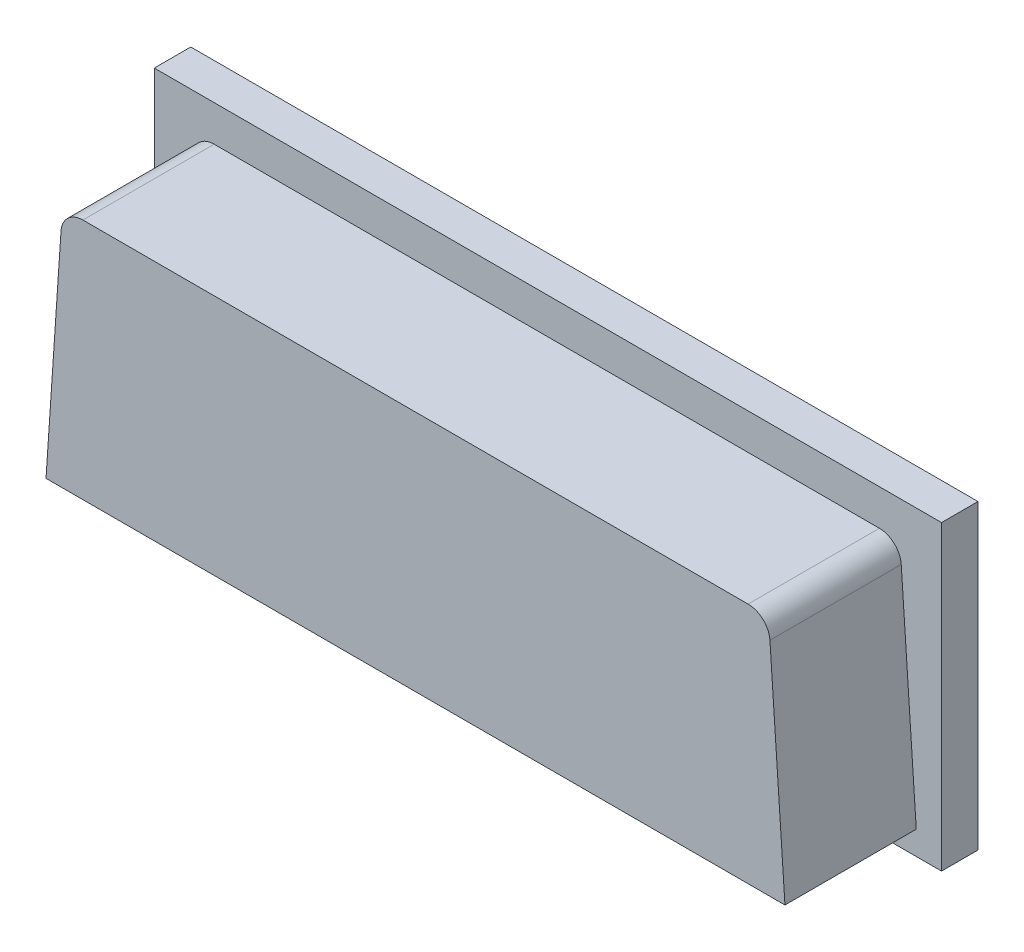
ISO-10303-21;
HEADER;
FILE_DESCRIPTION(('STEP AP214'),'2;1');
FILE_NAME('part.step','',(''),(''),'','','');
FILE_SCHEMA(('AUTOMOTIVE_DESIGN { 1 0 10303 214 1 1 1 1 }'));
ENDSEC;
DATA;
#1=APPLICATION_CONTEXT('core data for automotive mechanical design processes');
#2=APPLICATION_PROTOCOL_DEFINITION('international standard','automotive_design',2000,#1);
#3=PRODUCT_CONTEXT('',#1,'mechanical');
#4=PRODUCT('Part','Part','',(#3));
#5=PRODUCT_RELATED_PRODUCT_CATEGORY('part','',(#4));
#6=PRODUCT_DEFINITION_FORMATION('','',#4);
#7=PRODUCT_DEFINITION_CONTEXT('part definition',#1,'design');
#8=PRODUCT_DEFINITION('design','',#6,#7);
#9=PRODUCT_DEFINITION_SHAPE('','',#8);
#10=(LENGTH_UNIT() NAMED_UNIT(*) SI_UNIT(.MILLI.,.METRE.));
#11=(NAMED_UNIT(*) PLANE_ANGLE_UNIT() SI_UNIT($,.RADIAN.));
#12=(NAMED_UNIT(*) SI_UNIT($,.STERADIAN.) SOLID_ANGLE_UNIT());
#13=UNCERTAINTY_MEASURE_WITH_UNIT(LENGTH_MEASURE(1.E-05),#10,'distance_accuracy_value','');
#14=(GEOMETRIC_REPRESENTATION_CONTEXT(3) GLOBAL_UNCERTAINTY_ASSIGNED_CONTEXT((#13)) GLOBAL_UNIT_ASSIGNED_CONTEXT((#10,
#11,#12)) REPRESENTATION_CONTEXT('',''));
#15=CARTESIAN_POINT('',(0.,0.,0.));
#16=DIRECTION('',(0.,0.,1.));
#17=DIRECTION('',(1.,0.,0.));
#18=AXIS2_PLACEMENT_3D('',#15,#16,#17);
#19=CARTESIAN_POINT('',(0.,0.,18.));
#20=DIRECTION('',(0.997711420500141,-0.0676159848230516,0.));
#21=DIRECTION('',(0.0676159848230516,0.997711420500141,0.));
#22=AXIS2_PLACEMENT_3D('',#19,#20,#21);
#23=PLANE('',#22);
#24=DIRECTION('',(-0.0676159848230516,-0.997711420500141,0.));
#25=VECTOR('',#24,1.);
#26=CARTESIAN_POINT('',(0.,0.,18.));
#27=LINE('',#26,#25);
#28=CARTESIAN_POINT('',(2.06043397281794,30.4028479544692,18.));
#29=VERTEX_POINT('',#28);
#30=CARTESIAN_POINT('',(0.,0.,18.));
#31=VERTEX_POINT('',#30);
#32=EDGE_CURVE('E147',#29,#31,#27,.T.);
#33=ORIENTED_EDGE('',*,*,#32,.F.);
#34=DIRECTION('',(0.,0.,-1.));
#35=VECTOR('',#34,1.);
#36=CARTESIAN_POINT('',(2.06043397281794,30.4028479544692,18.));
#37=LINE('',#36,#35);
#38=CARTESIAN_POINT('',(2.06043397281794,30.4028479544692,0.));
#39=VERTEX_POINT('',#38);
#40=EDGE_CURVE('E167',#29,#39,#37,.T.);
#41=ORIENTED_EDGE('',*,*,#40,.T.);
#42=DIRECTION('',(-0.0676159848230516,-0.997711420500141,0.));
#43=VECTOR('',#42,1.);
#44=CARTESIAN_POINT('',(0.,0.,0.));
#45=LINE('',#44,#43);
#46=CARTESIAN_POINT('',(0.,0.,0.));
#47=VERTEX_POINT('',#46);
#48=EDGE_CURVE('E138',#39,#47,#45,.T.);
#49=ORIENTED_EDGE('',*,*,#48,.T.);
#50=DIRECTION('',(0.,0.,-1.));
#51=VECTOR('',#50,1.);
#52=CARTESIAN_POINT('',(0.,0.,18.));
#53=LINE('',#52,#51);
#54=EDGE_CURVE('E164',#31,#47,#53,.T.);
#55=ORIENTED_EDGE('',*,*,#54,.F.);
#56=EDGE_LOOP('',(#33,#41,#49,#55));
#57=FACE_BOUND('',#56,.T.);
#58=ADVANCED_FACE('F34',(#57),#23,.F.);
#59=CARTESIAN_POINT('',(0.,0.,18.));
#60=DIRECTION('',(0.,1.,0.));
#61=DIRECTION('',(0.,0.,1.));
#62=AXIS2_PLACEMENT_3D('',#59,#60,#61);
#63=PLANE('',#62);
#64=DIRECTION('',(1.,0.,0.));
#65=VECTOR('',#64,1.);
#66=CARTESIAN_POINT('',(0.,0.,0.));
#67=LINE('',#66,#65);
#68=CARTESIAN_POINT('',(101.3,0.,0.));
#69=VERTEX_POINT('',#68);
#70=EDGE_CURVE('E141',#47,#69,#67,.T.);
#71=ORIENTED_EDGE('',*,*,#70,.T.);
#72=DIRECTION('',(0.,0.,-1.));
#73=VECTOR('',#72,1.);
#74=CARTESIAN_POINT('',(101.3,0.,18.));
#75=LINE('',#74,#73);
#76=CARTESIAN_POINT('',(101.3,0.,18.));
#77=VERTEX_POINT('',#76);
#78=EDGE_CURVE('E155',#77,#69,#75,.T.);
#79=ORIENTED_EDGE('',*,*,#78,.F.);
#80=DIRECTION('',(1.,0.,0.));
#81=VECTOR('',#80,1.);
#82=CARTESIAN_POINT('',(0.,0.,18.));
#83=LINE('',#82,#81);
#84=EDGE_CURVE('E149',#31,#77,#83,.T.);
#85=ORIENTED_EDGE('',*,*,#84,.F.);
#86=ORIENTED_EDGE('',*,*,#54,.T.);
#87=EDGE_LOOP('',(#71,#79,#85,#86));
#88=FACE_BOUND('',#87,.T.);
#89=ADVANCED_FACE('F201',(#88),#63,.F.);
#90=CARTESIAN_POINT('',(101.3,0.,18.));
#91=DIRECTION('',(-0.997711420500141,-0.0676159848230517,0.));
#92=DIRECTION('',(0.0676159848230517,-0.997711420500141,0.));
#93=AXIS2_PLACEMENT_3D('',#90,#91,#92);
#94=PLANE('',#93);
#95=DIRECTION('',(-0.0676159848230517,0.997711420500141,0.));
#96=VECTOR('',#95,1.);
#97=CARTESIAN_POINT('',(101.3,0.,0.));
#98=LINE('',#97,#96);
#99=CARTESIAN_POINT('',(99.2395660271821,30.4028479544692,0.));
#100=VERTEX_POINT('',#99);
#101=EDGE_CURVE('E159',#69,#100,#98,.T.);
#102=ORIENTED_EDGE('',*,*,#101,.T.);
#103=DIRECTION('',(0.,0.,-1.));
#104=VECTOR('',#103,1.);
#105=CARTESIAN_POINT('',(99.2395660271821,30.4028479544692,18.));
#106=LINE('',#105,#104);
#107=CARTESIAN_POINT('',(99.2395660271821,30.4028479544692,18.));
#108=VERTEX_POINT('',#107);
#109=EDGE_CURVE('E11',#100,#108,#106,.F.);
#110=ORIENTED_EDGE('',*,*,#109,.T.);
#111=DIRECTION('',(-0.0676159848230517,0.997711420500141,0.));
#112=VECTOR('',#111,1.);
#113=CARTESIAN_POINT('',(101.3,0.,18.));
#114=LINE('',#113,#112);
#115=EDGE_CURVE('E152',#77,#108,#114,.T.);
#116=ORIENTED_EDGE('',*,*,#115,.F.);
#117=ORIENTED_EDGE('',*,*,#78,.T.);
#118=EDGE_LOOP('',(#102,#110,#116,#117));
#119=FACE_BOUND('',#118,.T.);
#120=ADVANCED_FACE('F198',(#119),#94,.F.);
#121=CARTESIAN_POINT('',(2.25,33.2,18.));
#122=DIRECTION('',(0.,-1.,0.));
#123=DIRECTION('',(1.,0.,0.));
#124=AXIS2_PLACEMENT_3D('',#121,#122,#123);
#125=PLANE('',#124);
#126=DIRECTION('',(-1.,0.,0.));
#127=VECTOR('',#126,1.);
#128=CARTESIAN_POINT('',(2.25,33.2,0.));
#129=LINE('',#128,#127);
#130=CARTESIAN_POINT('',(96.2464317656816,33.2,0.));
#131=VERTEX_POINT('',#130);
#132=CARTESIAN_POINT('',(5.05356823431836,33.2,0.));
#133=VERTEX_POINT('',#132);
#134=EDGE_CURVE('E150',#131,#133,#129,.T.);
#135=ORIENTED_EDGE('',*,*,#134,.T.);
#136=DIRECTION('',(0.,0.,-1.));
#137=VECTOR('',#136,1.);
#138=CARTESIAN_POINT('',(5.05356823431836,33.2,18.));
#139=LINE('',#138,#137);
#140=CARTESIAN_POINT('',(5.05356823431836,33.2,18.));
#141=VERTEX_POINT('',#140);
#142=EDGE_CURVE('E55',#133,#141,#139,.F.);
#143=ORIENTED_EDGE('',*,*,#142,.T.);
#144=DIRECTION('',(-1.,0.,0.));
#145=VECTOR('',#144,1.);
#146=CARTESIAN_POINT('',(2.25,33.2,18.));
#147=LINE('',#146,#145);
#148=CARTESIAN_POINT('',(96.2464317656816,33.2,18.));
#149=VERTEX_POINT('',#148);
#150=EDGE_CURVE('E154',#149,#141,#147,.T.);
#151=ORIENTED_EDGE('',*,*,#150,.F.);
#152=DIRECTION('',(0.,0.,-1.));
#153=VECTOR('',#152,1.);
#154=CARTESIAN_POINT('',(96.2464317656816,33.2,18.));
#155=LINE('',#154,#153);
#156=EDGE_CURVE('E174',#149,#131,#155,.T.);
#157=ORIENTED_EDGE('',*,*,#156,.T.);
#158=EDGE_LOOP('',(#135,#143,#151,#157));
#159=FACE_BOUND('',#158,.T.);
#160=ADVANCED_FACE('F194',(#159),#125,.F.);
#161=CARTESIAN_POINT('',(0.,0.,18.));
#162=DIRECTION('',(0.,0.,-1.));
#163=DIRECTION('',(-1.,0.,0.));
#164=AXIS2_PLACEMENT_3D('',#161,#162,#163);
#165=PLANE('',#164);
#166=ORIENTED_EDGE('',*,*,#150,.T.);
#167=CARTESIAN_POINT('',(5.05356823431836,30.2,18.));
#168=DIRECTION('',(0.,0.,-1.));
#169=DIRECTION('',(-1.,0.,0.));
#170=AXIS2_PLACEMENT_3D('',#167,#168,#169);
#171=CIRCLE('',#170,3.);
#172=EDGE_CURVE('E42',#141,#29,#171,.F.);
#173=ORIENTED_EDGE('',*,*,#172,.T.);
#174=ORIENTED_EDGE('',*,*,#32,.T.);
#175=ORIENTED_EDGE('',*,*,#84,.T.);
#176=ORIENTED_EDGE('',*,*,#115,.T.);
#177=CARTESIAN_POINT('',(96.2464317656816,30.2,18.));
#178=DIRECTION('',(0.,0.,-1.));
#179=DIRECTION('',(-1.,0.,0.));
#180=AXIS2_PLACEMENT_3D('',#177,#178,#179);
#181=CIRCLE('',#180,3.);
#182=EDGE_CURVE('E178',#108,#149,#181,.F.);
#183=ORIENTED_EDGE('',*,*,#182,.T.);
#184=EDGE_LOOP('',(#166,#173,#174,#175,#176,#183));
#185=FACE_BOUND('',#184,.T.);
#186=ADVANCED_FACE('F182',(#185),#165,.F.);
#187=CARTESIAN_POINT('',(5.05356823431836,30.2,18.));
#188=DIRECTION('',(0.,0.,-1.));
#189=DIRECTION('',(-1.,0.,0.));
#190=AXIS2_PLACEMENT_3D('',#187,#188,#189);
#191=CYLINDRICAL_SURFACE('',#190,3.);
#192=ORIENTED_EDGE('',*,*,#172,.F.);
#193=ORIENTED_EDGE('',*,*,#142,.F.);
#194=CARTESIAN_POINT('',(5.05356823431836,30.2,0.));
#195=DIRECTION('',(0.,0.,-1.));
#196=DIRECTION('',(-1.,0.,0.));
#197=AXIS2_PLACEMENT_3D('',#194,#195,#196);
#198=CIRCLE('',#197,3.);
#199=EDGE_CURVE('E172',#39,#133,#198,.T.);
#200=ORIENTED_EDGE('',*,*,#199,.F.);
#201=ORIENTED_EDGE('',*,*,#40,.F.);
#202=EDGE_LOOP('',(#192,#193,#200,#201));
#203=FACE_BOUND('',#202,.T.);
#204=ADVANCED_FACE('F189',(#203),#191,.T.);
#205=CARTESIAN_POINT('',(96.2464317656816,30.2,18.));
#206=DIRECTION('',(0.,0.,-1.));
#207=DIRECTION('',(-1.,0.,0.));
#208=AXIS2_PLACEMENT_3D('',#205,#206,#207);
#209=CYLINDRICAL_SURFACE('',#208,3.);
#210=ORIENTED_EDGE('',*,*,#182,.F.);
#211=ORIENTED_EDGE('',*,*,#109,.F.);
#212=CARTESIAN_POINT('',(96.2464317656816,30.2,0.));
#213=DIRECTION('',(0.,0.,-1.));
#214=DIRECTION('',(-1.,0.,0.));
#215=AXIS2_PLACEMENT_3D('',#212,#213,#214);
#216=CIRCLE('',#215,3.);
#217=EDGE_CURVE('E170',#131,#100,#216,.T.);
#218=ORIENTED_EDGE('',*,*,#217,.F.);
#219=ORIENTED_EDGE('',*,*,#156,.F.);
#220=EDGE_LOOP('',(#210,#211,#218,#219));
#221=FACE_BOUND('',#220,.T.);
#222=ADVANCED_FACE('F36',(#221),#209,.T.);
#223=CARTESIAN_POINT('',(104.763342239961,38.1357617971895,-5.));
#224=DIRECTION('',(-1.,0.,0.));
#225=DIRECTION('',(0.,0.,1.));
#226=AXIS2_PLACEMENT_3D('',#223,#224,#225);
#227=PLANE('',#226);
#228=DIRECTION('',(0.,-1.,0.));
#229=VECTOR('',#228,1.);
#230=CARTESIAN_POINT('',(104.763342239961,38.1357617971895,0.));
#231=LINE('',#230,#229);
#232=CARTESIAN_POINT('',(104.763342239961,38.1357617971895,0.));
#233=VERTEX_POINT('',#232);
#234=CARTESIAN_POINT('',(104.763342239961,-3.24502932748656,0.));
#235=VERTEX_POINT('',#234);
#236=EDGE_CURVE('E137',#233,#235,#231,.T.);
#237=ORIENTED_EDGE('',*,*,#236,.T.);
#238=DIRECTION('',(0.,0.,1.));
#239=VECTOR('',#238,1.);
#240=CARTESIAN_POINT('',(104.763342239961,-3.24502932748656,-5.));
#241=LINE('',#240,#239);
#242=CARTESIAN_POINT('',(104.763342239961,-3.24502932748656,-5.));
#243=VERTEX_POINT('',#242);
#244=EDGE_CURVE('E117',#243,#235,#241,.T.);
#245=ORIENTED_EDGE('',*,*,#244,.F.);
#246=DIRECTION('',(0.,-1.,0.));
#247=VECTOR('',#246,1.);
#248=CARTESIAN_POINT('',(104.763342239961,38.1357617971895,-5.));
#249=LINE('',#248,#247);
#250=CARTESIAN_POINT('',(104.763342239961,38.1357617971895,-5.));
#251=VERTEX_POINT('',#250);
#252=EDGE_CURVE('E124',#251,#243,#249,.T.);
#253=ORIENTED_EDGE('',*,*,#252,.F.);
#254=DIRECTION('',(0.,0.,1.));
#255=VECTOR('',#254,1.);
#256=CARTESIAN_POINT('',(104.763342239961,38.1357617971895,-5.));
#257=LINE('',#256,#255);
#258=EDGE_CURVE('E310',#251,#233,#257,.T.);
#259=ORIENTED_EDGE('',*,*,#258,.T.);
#260=EDGE_LOOP('',(#237,#245,#253,#259));
#261=FACE_BOUND('',#260,.T.);
#262=ADVANCED_FACE('F135',(#261),#227,.F.);
#263=CARTESIAN_POINT('',(104.763342239961,-3.24502932748656,-5.));
#264=DIRECTION('',(0.,1.,0.));
#265=DIRECTION('',(0.,0.,1.));
#266=AXIS2_PLACEMENT_3D('',#263,#264,#265);
#267=PLANE('',#266);
#268=DIRECTION('',(-1.,0.,0.));
#269=VECTOR('',#268,1.);
#270=CARTESIAN_POINT('',(104.763342239961,-3.24502932748656,0.));
#271=LINE('',#270,#269);
#272=CARTESIAN_POINT('',(-3.15529664846212,-3.24502932748656,0.));
#273=VERTEX_POINT('',#272);
#274=EDGE_CURVE('E316',#235,#273,#271,.T.);
#275=ORIENTED_EDGE('',*,*,#274,.T.);
#276=DIRECTION('',(0.,0.,1.));
#277=VECTOR('',#276,1.);
#278=CARTESIAN_POINT('',(-3.15529664846212,-3.24502932748656,-5.));
#279=LINE('',#278,#277);
#280=CARTESIAN_POINT('',(-3.15529664846212,-3.24502932748656,-5.));
#281=VERTEX_POINT('',#280);
#282=EDGE_CURVE('E120',#281,#273,#279,.T.);
#283=ORIENTED_EDGE('',*,*,#282,.F.);
#284=DIRECTION('',(-1.,0.,0.));
#285=VECTOR('',#284,1.);
#286=CARTESIAN_POINT('',(104.763342239961,-3.24502932748656,-5.));
#287=LINE('',#286,#285);
#288=EDGE_CURVE('E113',#243,#281,#287,.T.);
#289=ORIENTED_EDGE('',*,*,#288,.F.);
#290=ORIENTED_EDGE('',*,*,#244,.T.);
#291=EDGE_LOOP('',(#275,#283,#289,#290));
#292=FACE_BOUND('',#291,.T.);
#293=ADVANCED_FACE('F115',(#292),#267,.F.);
#294=CARTESIAN_POINT('',(-3.15529664846212,38.1357617971895,-5.));
#295=DIRECTION('',(1.,0.,0.));
#296=DIRECTION('',(0.,0.,-1.));
#297=AXIS2_PLACEMENT_3D('',#294,#295,#296);
#298=PLANE('',#297);
#299=DIRECTION('',(0.,1.,0.));
#300=VECTOR('',#299,1.);
#301=CARTESIAN_POINT('',(-3.15529664846212,38.1357617971895,0.));
#302=LINE('',#301,#300);
#303=CARTESIAN_POINT('',(-3.15529664846212,38.1357617971895,0.));
#304=VERTEX_POINT('',#303);
#305=EDGE_CURVE('E313',#273,#304,#302,.T.);
#306=ORIENTED_EDGE('',*,*,#305,.T.);
#307=DIRECTION('',(0.,0.,1.));
#308=VECTOR('',#307,1.);
#309=CARTESIAN_POINT('',(-3.15529664846212,38.1357617971895,-5.));
#310=LINE('',#309,#308);
#311=CARTESIAN_POINT('',(-3.15529664846212,38.1357617971895,-5.));
#312=VERTEX_POINT('',#311);
#313=EDGE_CURVE('E143',#312,#304,#310,.T.);
#314=ORIENTED_EDGE('',*,*,#313,.F.);
#315=DIRECTION('',(0.,1.,0.));
#316=VECTOR('',#315,1.);
#317=CARTESIAN_POINT('',(-3.15529664846212,38.1357617971895,-5.));
#318=LINE('',#317,#316);
#319=EDGE_CURVE('E123',#281,#312,#318,.T.);
#320=ORIENTED_EDGE('',*,*,#319,.F.);
#321=ORIENTED_EDGE('',*,*,#282,.T.);
#322=EDGE_LOOP('',(#306,#314,#320,#321));
#323=FACE_BOUND('',#322,.T.);
#324=ADVANCED_FACE('F225',(#323),#298,.F.);
#325=CARTESIAN_POINT('',(104.763342239961,38.1357617971895,-5.));
#326=DIRECTION('',(0.,-1.,0.));
#327=DIRECTION('',(0.,0.,-1.));
#328=AXIS2_PLACEMENT_3D('',#325,#326,#327);
#329=PLANE('',#328);
#330=DIRECTION('',(1.,0.,0.));
#331=VECTOR('',#330,1.);
#332=CARTESIAN_POINT('',(104.763342239961,38.1357617971895,0.));
#333=LINE('',#332,#331);
#334=EDGE_CURVE('E133',#304,#233,#333,.T.);
#335=ORIENTED_EDGE('',*,*,#334,.T.);
#336=ORIENTED_EDGE('',*,*,#258,.F.);
#337=DIRECTION('',(1.,0.,0.));
#338=VECTOR('',#337,1.);
#339=CARTESIAN_POINT('',(104.763342239961,38.1357617971895,-5.));
#340=LINE('',#339,#338);
#341=EDGE_CURVE('E129',#312,#251,#340,.T.);
#342=ORIENTED_EDGE('',*,*,#341,.F.);
#343=ORIENTED_EDGE('',*,*,#313,.T.);
#344=EDGE_LOOP('',(#335,#336,#342,#343));
#345=FACE_BOUND('',#344,.T.);
#346=ADVANCED_FACE('F228',(#345),#329,.F.);
#347=CARTESIAN_POINT('',(0.,0.,-5.));
#348=DIRECTION('',(0.,0.,-1.));
#349=DIRECTION('',(-1.,0.,0.));
#350=AXIS2_PLACEMENT_3D('',#347,#348,#349);
#351=PLANE('',#350);
#352=ORIENTED_EDGE('',*,*,#252,.T.);
#353=ORIENTED_EDGE('',*,*,#288,.T.);
#354=ORIENTED_EDGE('',*,*,#319,.T.);
#355=ORIENTED_EDGE('',*,*,#341,.T.);
#356=EDGE_LOOP('',(#352,#353,#354,#355));
#357=FACE_BOUND('',#356,.T.);
#358=ADVANCED_FACE('F127',(#357),#351,.T.);
#359=CARTESIAN_POINT('',(0.,0.,0.));
#360=DIRECTION('',(0.,0.,-1.));
#361=DIRECTION('',(-1.,0.,0.));
#362=AXIS2_PLACEMENT_3D('',#359,#360,#361);
#363=PLANE('',#362);
#364=ORIENTED_EDGE('',*,*,#48,.F.);
#365=ORIENTED_EDGE('',*,*,#199,.T.);
#366=ORIENTED_EDGE('',*,*,#134,.F.);
#367=ORIENTED_EDGE('',*,*,#217,.T.);
#368=ORIENTED_EDGE('',*,*,#101,.F.);
#369=ORIENTED_EDGE('',*,*,#70,.F.);
#370=EDGE_LOOP('',(#364,#365,#366,#367,#368,#369));
#371=FACE_BOUND('',#370,.T.);
#372=ORIENTED_EDGE('',*,*,#236,.F.);
#373=ORIENTED_EDGE('',*,*,#334,.F.);
#374=ORIENTED_EDGE('',*,*,#305,.F.);
#375=ORIENTED_EDGE('',*,*,#274,.F.);
#376=EDGE_LOOP('',(#372,#373,#374,#375));
#377=FACE_BOUND('',#376,.T.);
#378=ADVANCED_FACE('F191',(#371,#377),#363,.F.);
#379=CLOSED_SHELL('',(#58,#89,#120,#160,#186,#204,#222,#262,#293,#324,#346,#358,#378));
#380=MANIFOLD_SOLID_BREP('B2',#379);
#381=ADVANCED_BREP_SHAPE_REPRESENTATION('',(#18,#380),#14);
#382=SHAPE_DEFINITION_REPRESENTATION(#9,#381);
ENDSEC;
END-ISO-10303-21;
